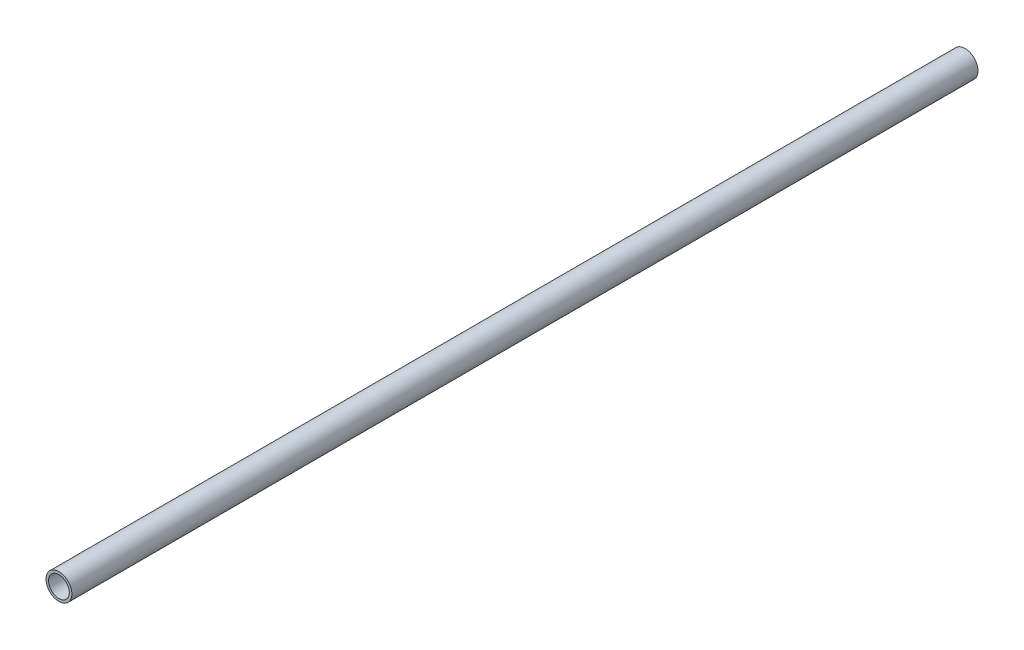
ISO-10303-21;
HEADER;
FILE_DESCRIPTION(('STEP AP214'),'2;1');
FILE_NAME('part.step','',(''),(''),'','','');
FILE_SCHEMA(('AUTOMOTIVE_DESIGN { 1 0 10303 214 1 1 1 1 }'));
ENDSEC;
DATA;
#1=APPLICATION_CONTEXT('core data for automotive mechanical design processes');
#2=APPLICATION_PROTOCOL_DEFINITION('international standard','automotive_design',2000,#1);
#3=PRODUCT_CONTEXT('',#1,'mechanical');
#4=PRODUCT('Part','Part','',(#3));
#5=PRODUCT_RELATED_PRODUCT_CATEGORY('part','',(#4));
#6=PRODUCT_DEFINITION_FORMATION('','',#4);
#7=PRODUCT_DEFINITION_CONTEXT('part definition',#1,'design');
#8=PRODUCT_DEFINITION('design','',#6,#7);
#9=PRODUCT_DEFINITION_SHAPE('','',#8);
#10=(LENGTH_UNIT() NAMED_UNIT(*) SI_UNIT(.MILLI.,.METRE.));
#11=(NAMED_UNIT(*) PLANE_ANGLE_UNIT() SI_UNIT($,.RADIAN.));
#12=(NAMED_UNIT(*) SI_UNIT($,.STERADIAN.) SOLID_ANGLE_UNIT());
#13=UNCERTAINTY_MEASURE_WITH_UNIT(LENGTH_MEASURE(1.E-05),#10,'distance_accuracy_value','');
#14=(GEOMETRIC_REPRESENTATION_CONTEXT(3) GLOBAL_UNCERTAINTY_ASSIGNED_CONTEXT((#13)) GLOBAL_UNIT_ASSIGNED_CONTEXT((#10,
#11,#12)) REPRESENTATION_CONTEXT('',''));
#15=CARTESIAN_POINT('',(0.,0.,0.));
#16=DIRECTION('',(0.,0.,1.));
#17=DIRECTION('',(1.,0.,0.));
#18=AXIS2_PLACEMENT_3D('',#15,#16,#17);
#19=CARTESIAN_POINT('',(0.,0.,350.));
#20=DIRECTION('',(0.,0.,-1.));
#21=DIRECTION('',(-1.,0.,0.));
#22=AXIS2_PLACEMENT_3D('',#19,#20,#21);
#23=CYLINDRICAL_SURFACE('',#22,5.);
#24=CARTESIAN_POINT('',(0.,0.,350.));
#25=DIRECTION('',(0.,0.,1.));
#26=DIRECTION('',(1.,0.,0.));
#27=AXIS2_PLACEMENT_3D('',#24,#25,#26);
#28=CIRCLE('',#27,5.);
#29=CARTESIAN_POINT('',(5.,0.,350.));
#30=VERTEX_POINT('',#29);
#31=EDGE_CURVE('E10',#30,#30,#28,.T.);
#32=ORIENTED_EDGE('',*,*,#31,.F.);
#33=EDGE_LOOP('',(#32));
#34=FACE_BOUND('',#33,.T.);
#35=CARTESIAN_POINT('',(0.,0.,0.));
#36=DIRECTION('',(0.,0.,1.));
#37=DIRECTION('',(1.,0.,0.));
#38=AXIS2_PLACEMENT_3D('',#35,#36,#37);
#39=CIRCLE('',#38,5.);
#40=CARTESIAN_POINT('',(5.,0.,0.));
#41=VERTEX_POINT('',#40);
#42=EDGE_CURVE('E42',#41,#41,#39,.T.);
#43=ORIENTED_EDGE('',*,*,#42,.T.);
#44=EDGE_LOOP('',(#43));
#45=FACE_BOUND('',#44,.T.);
#46=ADVANCED_FACE('F39',(#34,#45),#23,.T.);
#47=CARTESIAN_POINT('',(0.,0.,350.));
#48=DIRECTION('',(0.,0.,1.));
#49=DIRECTION('',(1.,0.,0.));
#50=AXIS2_PLACEMENT_3D('',#47,#48,#49);
#51=PLANE('',#50);
#52=CARTESIAN_POINT('',(0.,0.,350.));
#53=DIRECTION('',(0.,0.,-1.));
#54=DIRECTION('',(-1.,0.,0.));
#55=AXIS2_PLACEMENT_3D('',#52,#53,#54);
#56=CIRCLE('',#55,4.);
#57=CARTESIAN_POINT('',(-4.,0.,350.));
#58=VERTEX_POINT('',#57);
#59=EDGE_CURVE('E49',#58,#58,#56,.T.);
#60=ORIENTED_EDGE('',*,*,#59,.T.);
#61=EDGE_LOOP('',(#60));
#62=FACE_BOUND('',#61,.T.);
#63=ORIENTED_EDGE('',*,*,#31,.T.);
#64=EDGE_LOOP('',(#63));
#65=FACE_BOUND('',#64,.T.);
#66=ADVANCED_FACE('F57',(#62,#65),#51,.T.);
#67=CARTESIAN_POINT('',(0.,0.,0.));
#68=DIRECTION('',(0.,0.,1.));
#69=DIRECTION('',(1.,0.,0.));
#70=AXIS2_PLACEMENT_3D('',#67,#68,#69);
#71=PLANE('',#70);
#72=CARTESIAN_POINT('',(0.,0.,0.));
#73=DIRECTION('',(0.,0.,-1.));
#74=DIRECTION('',(-1.,0.,0.));
#75=AXIS2_PLACEMENT_3D('',#72,#73,#74);
#76=CIRCLE('',#75,4.);
#77=CARTESIAN_POINT('',(-4.,0.,0.));
#78=VERTEX_POINT('',#77);
#79=EDGE_CURVE('E51',#78,#78,#76,.T.);
#80=ORIENTED_EDGE('',*,*,#79,.F.);
#81=EDGE_LOOP('',(#80));
#82=FACE_BOUND('',#81,.T.);
#83=ORIENTED_EDGE('',*,*,#42,.F.);
#84=EDGE_LOOP('',(#83));
#85=FACE_BOUND('',#84,.T.);
#86=ADVANCED_FACE('F62',(#82,#85),#71,.F.);
#87=CARTESIAN_POINT('',(0.,0.,350.));
#88=DIRECTION('',(0.,0.,-1.));
#89=DIRECTION('',(-1.,0.,0.));
#90=AXIS2_PLACEMENT_3D('',#87,#88,#89);
#91=CYLINDRICAL_SURFACE('',#90,4.);
#92=ORIENTED_EDGE('',*,*,#59,.F.);
#93=EDGE_LOOP('',(#92));
#94=FACE_BOUND('',#93,.T.);
#95=ORIENTED_EDGE('',*,*,#79,.T.);
#96=EDGE_LOOP('',(#95));
#97=FACE_BOUND('',#96,.T.);
#98=ADVANCED_FACE('F59',(#94,#97),#91,.F.);
#99=CLOSED_SHELL('',(#46,#66,#86,#98));
#100=MANIFOLD_SOLID_BREP('B2',#99);
#101=ADVANCED_BREP_SHAPE_REPRESENTATION('',(#18,#100),#14);
#102=SHAPE_DEFINITION_REPRESENTATION(#9,#101);
ENDSEC;
END-ISO-10303-21;
